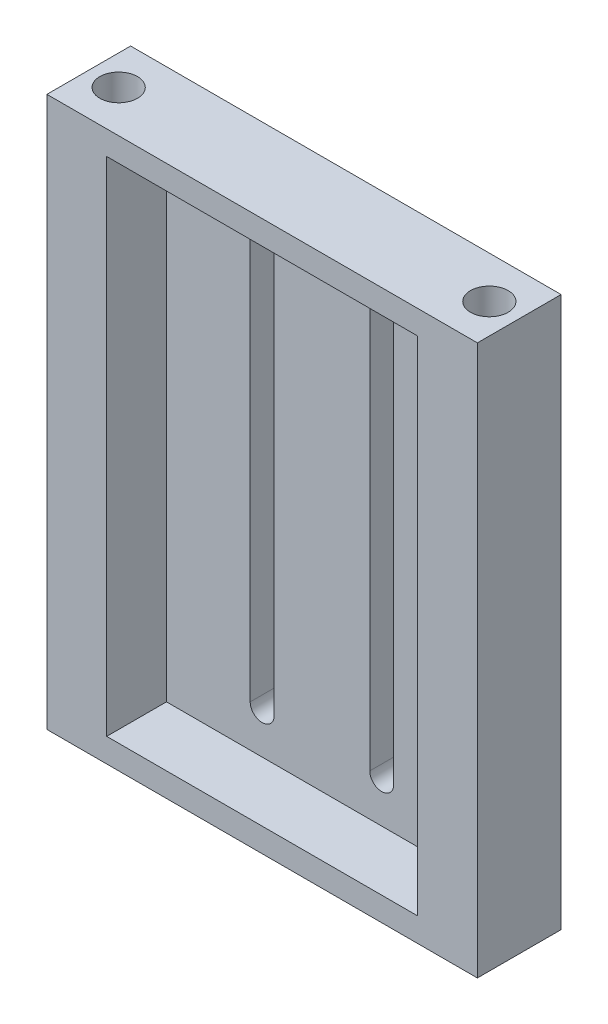
ISO-10303-21;
HEADER;
FILE_DESCRIPTION(('STEP AP214'),'2;1');
FILE_NAME('part.step','',(''),(''),'','','');
FILE_SCHEMA(('AUTOMOTIVE_DESIGN { 1 0 10303 214 1 1 1 1 }'));
ENDSEC;
DATA;
#1=APPLICATION_CONTEXT('core data for automotive mechanical design processes');
#2=APPLICATION_PROTOCOL_DEFINITION('international standard','automotive_design',2000,#1);
#3=PRODUCT_CONTEXT('',#1,'mechanical');
#4=PRODUCT('Part','Part','',(#3));
#5=PRODUCT_RELATED_PRODUCT_CATEGORY('part','',(#4));
#6=PRODUCT_DEFINITION_FORMATION('','',#4);
#7=PRODUCT_DEFINITION_CONTEXT('part definition',#1,'design');
#8=PRODUCT_DEFINITION('design','',#6,#7);
#9=PRODUCT_DEFINITION_SHAPE('','',#8);
#10=(LENGTH_UNIT() NAMED_UNIT(*) SI_UNIT(.MILLI.,.METRE.));
#11=(NAMED_UNIT(*) PLANE_ANGLE_UNIT() SI_UNIT($,.RADIAN.));
#12=(NAMED_UNIT(*) SI_UNIT($,.STERADIAN.) SOLID_ANGLE_UNIT());
#13=UNCERTAINTY_MEASURE_WITH_UNIT(LENGTH_MEASURE(1.E-05),#10,'distance_accuracy_value','');
#14=(GEOMETRIC_REPRESENTATION_CONTEXT(3) GLOBAL_UNCERTAINTY_ASSIGNED_CONTEXT((#13)) GLOBAL_UNIT_ASSIGNED_CONTEXT((#10,
#11,#12)) REPRESENTATION_CONTEXT('',''));
#15=CARTESIAN_POINT('',(0.,0.,0.));
#16=DIRECTION('',(0.,0.,1.));
#17=DIRECTION('',(1.,0.,0.));
#18=AXIS2_PLACEMENT_3D('',#15,#16,#17);
#19=CARTESIAN_POINT('',(18.,23.,2.));
#20=DIRECTION('',(-1.,0.,0.));
#21=DIRECTION('',(0.,-1.,0.));
#22=AXIS2_PLACEMENT_3D('',#19,#20,#21);
#23=PLANE('',#22);
#24=DIRECTION('',(0.,1.,0.));
#25=VECTOR('',#24,1.);
#26=CARTESIAN_POINT('',(18.,23.,0.));
#27=LINE('',#26,#25);
#28=CARTESIAN_POINT('',(18.,-23.,0.));
#29=VERTEX_POINT('',#28);
#30=CARTESIAN_POINT('',(18.,23.,0.));
#31=VERTEX_POINT('',#30);
#32=EDGE_CURVE('E267',#29,#31,#27,.T.);
#33=ORIENTED_EDGE('',*,*,#32,.T.);
#34=DIRECTION('',(0.,0.,-1.));
#35=VECTOR('',#34,1.);
#36=CARTESIAN_POINT('',(18.,23.,2.));
#37=LINE('',#36,#35);
#38=CARTESIAN_POINT('',(18.,23.,7.));
#39=VERTEX_POINT('',#38);
#40=EDGE_CURVE('E11',#39,#31,#37,.T.);
#41=ORIENTED_EDGE('',*,*,#40,.F.);
#42=DIRECTION('',(0.,1.,0.));
#43=VECTOR('',#42,1.);
#44=CARTESIAN_POINT('',(18.,23.,7.));
#45=LINE('',#44,#43);
#46=CARTESIAN_POINT('',(18.,-23.,7.));
#47=VERTEX_POINT('',#46);
#48=EDGE_CURVE('E255',#47,#39,#45,.T.);
#49=ORIENTED_EDGE('',*,*,#48,.F.);
#50=DIRECTION('',(0.,0.,-1.));
#51=VECTOR('',#50,1.);
#52=CARTESIAN_POINT('',(18.,-23.,2.));
#53=LINE('',#52,#51);
#54=EDGE_CURVE('E276',#47,#29,#53,.T.);
#55=ORIENTED_EDGE('',*,*,#54,.T.);
#56=EDGE_LOOP('',(#33,#41,#49,#55));
#57=FACE_BOUND('',#56,.T.);
#58=ADVANCED_FACE('F33',(#57),#23,.F.);
#59=CARTESIAN_POINT('',(-18.,23.,2.));
#60=DIRECTION('',(0.,-1.,0.));
#61=DIRECTION('',(0.,0.,-1.));
#62=AXIS2_PLACEMENT_3D('',#59,#60,#61);
#63=PLANE('',#62);
#64=CARTESIAN_POINT('',(-15.5,23.,3.5));
#65=DIRECTION('',(0.,1.,0.));
#66=DIRECTION('',(0.,0.,1.));
#67=AXIS2_PLACEMENT_3D('',#64,#65,#66);
#68=CIRCLE('',#67,1.575);
#69=CARTESIAN_POINT('',(-15.5,23.,5.075));
#70=VERTEX_POINT('',#69);
#71=EDGE_CURVE('E219',#70,#70,#68,.T.);
#72=ORIENTED_EDGE('',*,*,#71,.F.);
#73=EDGE_LOOP('',(#72));
#74=FACE_BOUND('',#73,.T.);
#75=CARTESIAN_POINT('',(15.5,23.,3.5));
#76=DIRECTION('',(0.,1.,0.));
#77=DIRECTION('',(0.,0.,-1.));
#78=AXIS2_PLACEMENT_3D('',#75,#76,#77);
#79=CIRCLE('',#78,1.575);
#80=CARTESIAN_POINT('',(15.5,23.,1.92499999999999));
#81=VERTEX_POINT('',#80);
#82=EDGE_CURVE('E182',#81,#81,#79,.T.);
#83=ORIENTED_EDGE('',*,*,#82,.F.);
#84=EDGE_LOOP('',(#83));
#85=FACE_BOUND('',#84,.T.);
#86=DIRECTION('',(-1.,0.,0.));
#87=VECTOR('',#86,1.);
#88=CARTESIAN_POINT('',(-18.,23.,0.));
#89=LINE('',#88,#87);
#90=CARTESIAN_POINT('',(-18.,23.,0.));
#91=VERTEX_POINT('',#90);
#92=EDGE_CURVE('E270',#31,#91,#89,.T.);
#93=ORIENTED_EDGE('',*,*,#92,.T.);
#94=DIRECTION('',(0.,0.,-1.));
#95=VECTOR('',#94,1.);
#96=CARTESIAN_POINT('',(-18.,23.,2.));
#97=LINE('',#96,#95);
#98=CARTESIAN_POINT('',(-18.,23.,7.));
#99=VERTEX_POINT('',#98);
#100=EDGE_CURVE('E40',#99,#91,#97,.T.);
#101=ORIENTED_EDGE('',*,*,#100,.F.);
#102=DIRECTION('',(-1.,0.,0.));
#103=VECTOR('',#102,1.);
#104=CARTESIAN_POINT('',(-18.,23.,7.));
#105=LINE('',#104,#103);
#106=EDGE_CURVE('E258',#39,#99,#105,.T.);
#107=ORIENTED_EDGE('',*,*,#106,.F.);
#108=ORIENTED_EDGE('',*,*,#40,.T.);
#109=EDGE_LOOP('',(#93,#101,#107,#108));
#110=FACE_BOUND('',#109,.T.);
#111=ADVANCED_FACE('F300',(#74,#85,#110),#63,.F.);
#112=CARTESIAN_POINT('',(-18.,23.,2.));
#113=DIRECTION('',(1.,0.,0.));
#114=DIRECTION('',(0.,1.,0.));
#115=AXIS2_PLACEMENT_3D('',#112,#113,#114);
#116=PLANE('',#115);
#117=DIRECTION('',(0.,-1.,0.));
#118=VECTOR('',#117,1.);
#119=CARTESIAN_POINT('',(-18.,23.,0.));
#120=LINE('',#119,#118);
#121=CARTESIAN_POINT('',(-18.,-23.,0.));
#122=VERTEX_POINT('',#121);
#123=EDGE_CURVE('E272',#91,#122,#120,.T.);
#124=ORIENTED_EDGE('',*,*,#123,.T.);
#125=DIRECTION('',(0.,0.,-1.));
#126=VECTOR('',#125,1.);
#127=CARTESIAN_POINT('',(-18.,-23.,2.));
#128=LINE('',#127,#126);
#129=CARTESIAN_POINT('',(-18.,-23.,7.));
#130=VERTEX_POINT('',#129);
#131=EDGE_CURVE('E279',#130,#122,#128,.T.);
#132=ORIENTED_EDGE('',*,*,#131,.F.);
#133=DIRECTION('',(0.,-1.,0.));
#134=VECTOR('',#133,1.);
#135=CARTESIAN_POINT('',(-18.,23.,7.));
#136=LINE('',#135,#134);
#137=EDGE_CURVE('E261',#99,#130,#136,.T.);
#138=ORIENTED_EDGE('',*,*,#137,.F.);
#139=ORIENTED_EDGE('',*,*,#100,.T.);
#140=EDGE_LOOP('',(#124,#132,#138,#139));
#141=FACE_BOUND('',#140,.T.);
#142=ADVANCED_FACE('F285',(#141),#116,.F.);
#143=CARTESIAN_POINT('',(-18.,-23.,2.));
#144=DIRECTION('',(0.,1.,0.));
#145=DIRECTION('',(0.,0.,1.));
#146=AXIS2_PLACEMENT_3D('',#143,#144,#145);
#147=PLANE('',#146);
#148=CARTESIAN_POINT('',(-15.5,-23.,3.5));
#149=DIRECTION('',(0.,1.,0.));
#150=DIRECTION('',(0.,0.,1.));
#151=AXIS2_PLACEMENT_3D('',#148,#149,#150);
#152=CIRCLE('',#151,1.575);
#153=CARTESIAN_POINT('',(-15.5,-23.,5.075));
#154=VERTEX_POINT('',#153);
#155=EDGE_CURVE('E215',#154,#154,#152,.T.);
#156=ORIENTED_EDGE('',*,*,#155,.T.);
#157=EDGE_LOOP('',(#156));
#158=FACE_BOUND('',#157,.T.);
#159=CARTESIAN_POINT('',(15.5,-23.,3.5));
#160=DIRECTION('',(0.,1.,0.));
#161=DIRECTION('',(0.,0.,-1.));
#162=AXIS2_PLACEMENT_3D('',#159,#160,#161);
#163=CIRCLE('',#162,1.575);
#164=CARTESIAN_POINT('',(15.5,-23.,1.92499999999999));
#165=VERTEX_POINT('',#164);
#166=EDGE_CURVE('E222',#165,#165,#163,.T.);
#167=ORIENTED_EDGE('',*,*,#166,.T.);
#168=EDGE_LOOP('',(#167));
#169=FACE_BOUND('',#168,.T.);
#170=DIRECTION('',(1.,0.,0.));
#171=VECTOR('',#170,1.);
#172=CARTESIAN_POINT('',(-18.,-23.,0.));
#173=LINE('',#172,#171);
#174=EDGE_CURVE('E274',#122,#29,#173,.T.);
#175=ORIENTED_EDGE('',*,*,#174,.T.);
#176=ORIENTED_EDGE('',*,*,#54,.F.);
#177=DIRECTION('',(1.,0.,0.));
#178=VECTOR('',#177,1.);
#179=CARTESIAN_POINT('',(-18.,-23.,7.));
#180=LINE('',#179,#178);
#181=EDGE_CURVE('E264',#130,#47,#180,.T.);
#182=ORIENTED_EDGE('',*,*,#181,.F.);
#183=ORIENTED_EDGE('',*,*,#131,.T.);
#184=EDGE_LOOP('',(#175,#176,#182,#183));
#185=FACE_BOUND('',#184,.T.);
#186=ADVANCED_FACE('F293',(#158,#169,#185),#147,.F.);
#187=CARTESIAN_POINT('',(0.,0.,0.));
#188=DIRECTION('',(0.,0.,1.));
#189=DIRECTION('',(1.,0.,0.));
#190=AXIS2_PLACEMENT_3D('',#187,#188,#189);
#191=PLANE('',#190);
#192=DIRECTION('',(0.,-1.,0.));
#193=VECTOR('',#192,1.);
#194=CARTESIAN_POINT('',(6.00000000000001,17.5,0.));
#195=LINE('',#194,#193);
#196=CARTESIAN_POINT('',(6.00000000000001,17.5,0.));
#197=VERTEX_POINT('',#196);
#198=CARTESIAN_POINT('',(6.,-17.5,0.));
#199=VERTEX_POINT('',#198);
#200=EDGE_CURVE('E175',#197,#199,#195,.T.);
#201=ORIENTED_EDGE('',*,*,#200,.F.);
#202=CARTESIAN_POINT('',(5.,17.5,0.));
#203=DIRECTION('',(0.,0.,-1.));
#204=DIRECTION('',(-1.,0.,0.));
#205=AXIS2_PLACEMENT_3D('',#202,#203,#204);
#206=CIRCLE('',#205,1.);
#207=CARTESIAN_POINT('',(4.,17.5,0.));
#208=VERTEX_POINT('',#207);
#209=EDGE_CURVE('E47',#208,#197,#206,.T.);
#210=ORIENTED_EDGE('',*,*,#209,.F.);
#211=DIRECTION('',(0.,1.,0.));
#212=VECTOR('',#211,1.);
#213=CARTESIAN_POINT('',(4.,17.5,0.));
#214=LINE('',#213,#212);
#215=CARTESIAN_POINT('',(4.,-17.5,0.));
#216=VERTEX_POINT('',#215);
#217=EDGE_CURVE('E166',#216,#208,#214,.T.);
#218=ORIENTED_EDGE('',*,*,#217,.F.);
#219=CARTESIAN_POINT('',(5.,-17.5,0.));
#220=DIRECTION('',(0.,0.,-1.));
#221=DIRECTION('',(-1.,0.,0.));
#222=AXIS2_PLACEMENT_3D('',#219,#220,#221);
#223=CIRCLE('',#222,1.);
#224=EDGE_CURVE('E169',#199,#216,#223,.T.);
#225=ORIENTED_EDGE('',*,*,#224,.F.);
#226=EDGE_LOOP('',(#201,#210,#218,#225));
#227=FACE_BOUND('',#226,.T.);
#228=DIRECTION('',(0.,-1.,0.));
#229=VECTOR('',#228,1.);
#230=CARTESIAN_POINT('',(-4.,17.5,0.));
#231=LINE('',#230,#229);
#232=CARTESIAN_POINT('',(-4.,17.5,0.));
#233=VERTEX_POINT('',#232);
#234=CARTESIAN_POINT('',(-4.,-17.5,0.));
#235=VERTEX_POINT('',#234);
#236=EDGE_CURVE('E201',#233,#235,#231,.T.);
#237=ORIENTED_EDGE('',*,*,#236,.F.);
#238=CARTESIAN_POINT('',(-5.,17.5,0.));
#239=DIRECTION('',(0.,0.,-1.));
#240=DIRECTION('',(1.,0.,0.));
#241=AXIS2_PLACEMENT_3D('',#238,#239,#240);
#242=CIRCLE('',#241,1.00000000000001);
#243=CARTESIAN_POINT('',(-6.00000000000001,17.5,0.));
#244=VERTEX_POINT('',#243);
#245=EDGE_CURVE('E55',#244,#233,#242,.T.);
#246=ORIENTED_EDGE('',*,*,#245,.F.);
#247=DIRECTION('',(0.,1.,0.));
#248=VECTOR('',#247,1.);
#249=CARTESIAN_POINT('',(-6.00000000000001,17.5,0.));
#250=LINE('',#249,#248);
#251=CARTESIAN_POINT('',(-6.,-17.5,0.));
#252=VERTEX_POINT('',#251);
#253=EDGE_CURVE('E190',#252,#244,#250,.T.);
#254=ORIENTED_EDGE('',*,*,#253,.F.);
#255=CARTESIAN_POINT('',(-5.,-17.5,0.));
#256=DIRECTION('',(0.,0.,-1.));
#257=DIRECTION('',(1.,0.,0.));
#258=AXIS2_PLACEMENT_3D('',#255,#256,#257);
#259=CIRCLE('',#258,1.00000000000001);
#260=EDGE_CURVE('E204',#235,#252,#259,.T.);
#261=ORIENTED_EDGE('',*,*,#260,.F.);
#262=EDGE_LOOP('',(#237,#246,#254,#261));
#263=FACE_BOUND('',#262,.T.);
#264=ORIENTED_EDGE('',*,*,#32,.F.);
#265=ORIENTED_EDGE('',*,*,#174,.F.);
#266=ORIENTED_EDGE('',*,*,#123,.F.);
#267=ORIENTED_EDGE('',*,*,#92,.F.);
#268=EDGE_LOOP('',(#264,#265,#266,#267));
#269=FACE_BOUND('',#268,.T.);
#270=ADVANCED_FACE('F291',(#227,#263,#269),#191,.F.);
#271=CARTESIAN_POINT('',(0.,0.,7.));
#272=DIRECTION('',(0.,0.,1.));
#273=DIRECTION('',(1.,0.,0.));
#274=AXIS2_PLACEMENT_3D('',#271,#272,#273);
#275=PLANE('',#274);
#276=ORIENTED_EDGE('',*,*,#48,.T.);
#277=ORIENTED_EDGE('',*,*,#106,.T.);
#278=ORIENTED_EDGE('',*,*,#137,.T.);
#279=ORIENTED_EDGE('',*,*,#181,.T.);
#280=EDGE_LOOP('',(#276,#277,#278,#279));
#281=FACE_BOUND('',#280,.T.);
#282=DIRECTION('',(-1.,0.,0.));
#283=VECTOR('',#282,1.);
#284=CARTESIAN_POINT('',(-13.,21.,7.));
#285=LINE('',#284,#283);
#286=CARTESIAN_POINT('',(13.,21.,7.));
#287=VERTEX_POINT('',#286);
#288=CARTESIAN_POINT('',(-13.,21.,7.));
#289=VERTEX_POINT('',#288);
#290=EDGE_CURVE('E229',#287,#289,#285,.T.);
#291=ORIENTED_EDGE('',*,*,#290,.F.);
#292=DIRECTION('',(0.,1.,0.));
#293=VECTOR('',#292,1.);
#294=CARTESIAN_POINT('',(13.,21.,7.));
#295=LINE('',#294,#293);
#296=CARTESIAN_POINT('',(13.,-21.,7.));
#297=VERTEX_POINT('',#296);
#298=EDGE_CURVE('E227',#297,#287,#295,.T.);
#299=ORIENTED_EDGE('',*,*,#298,.F.);
#300=DIRECTION('',(1.,0.,0.));
#301=VECTOR('',#300,1.);
#302=CARTESIAN_POINT('',(-13.,-21.,7.));
#303=LINE('',#302,#301);
#304=CARTESIAN_POINT('',(-13.,-21.,7.));
#305=VERTEX_POINT('',#304);
#306=EDGE_CURVE('E235',#305,#297,#303,.T.);
#307=ORIENTED_EDGE('',*,*,#306,.F.);
#308=DIRECTION('',(0.,-1.,0.));
#309=VECTOR('',#308,1.);
#310=CARTESIAN_POINT('',(-13.,21.,7.));
#311=LINE('',#310,#309);
#312=EDGE_CURVE('E232',#289,#305,#311,.T.);
#313=ORIENTED_EDGE('',*,*,#312,.F.);
#314=EDGE_LOOP('',(#291,#299,#307,#313));
#315=FACE_BOUND('',#314,.T.);
#316=ADVANCED_FACE('F298',(#281,#315),#275,.T.);
#317=CARTESIAN_POINT('',(13.,21.,7.));
#318=DIRECTION('',(-1.,0.,0.));
#319=DIRECTION('',(0.,-1.,0.));
#320=AXIS2_PLACEMENT_3D('',#317,#318,#319);
#321=PLANE('',#320);
#322=DIRECTION('',(0.,1.,0.));
#323=VECTOR('',#322,1.);
#324=CARTESIAN_POINT('',(13.,21.,2.));
#325=LINE('',#324,#323);
#326=CARTESIAN_POINT('',(13.,-21.,2.));
#327=VERTEX_POINT('',#326);
#328=CARTESIAN_POINT('',(13.,21.,2.));
#329=VERTEX_POINT('',#328);
#330=EDGE_CURVE('E218',#327,#329,#325,.T.);
#331=ORIENTED_EDGE('',*,*,#330,.F.);
#332=DIRECTION('',(0.,0.,-1.));
#333=VECTOR('',#332,1.);
#334=CARTESIAN_POINT('',(13.,-21.,7.));
#335=LINE('',#334,#333);
#336=EDGE_CURVE('E237',#297,#327,#335,.T.);
#337=ORIENTED_EDGE('',*,*,#336,.F.);
#338=ORIENTED_EDGE('',*,*,#298,.T.);
#339=DIRECTION('',(0.,0.,-1.));
#340=VECTOR('',#339,1.);
#341=CARTESIAN_POINT('',(13.,21.,7.));
#342=LINE('',#341,#340);
#343=EDGE_CURVE('E252',#287,#329,#342,.T.);
#344=ORIENTED_EDGE('',*,*,#343,.T.);
#345=EDGE_LOOP('',(#331,#337,#338,#344));
#346=FACE_BOUND('',#345,.T.);
#347=ADVANCED_FACE('F323',(#346),#321,.T.);
#348=CARTESIAN_POINT('',(-13.,21.,7.));
#349=DIRECTION('',(0.,-1.,0.));
#350=DIRECTION('',(0.,0.,-1.));
#351=AXIS2_PLACEMENT_3D('',#348,#349,#350);
#352=PLANE('',#351);
#353=DIRECTION('',(-1.,0.,0.));
#354=VECTOR('',#353,1.);
#355=CARTESIAN_POINT('',(-13.,21.,2.));
#356=LINE('',#355,#354);
#357=CARTESIAN_POINT('',(-13.,21.,2.));
#358=VERTEX_POINT('',#357);
#359=EDGE_CURVE('E239',#329,#358,#356,.T.);
#360=ORIENTED_EDGE('',*,*,#359,.F.);
#361=ORIENTED_EDGE('',*,*,#343,.F.);
#362=ORIENTED_EDGE('',*,*,#290,.T.);
#363=DIRECTION('',(0.,0.,-1.));
#364=VECTOR('',#363,1.);
#365=CARTESIAN_POINT('',(-13.,21.,7.));
#366=LINE('',#365,#364);
#367=EDGE_CURVE('E249',#289,#358,#366,.T.);
#368=ORIENTED_EDGE('',*,*,#367,.T.);
#369=EDGE_LOOP('',(#360,#361,#362,#368));
#370=FACE_BOUND('',#369,.T.);
#371=ADVANCED_FACE('F326',(#370),#352,.T.);
#372=CARTESIAN_POINT('',(-13.,21.,7.));
#373=DIRECTION('',(1.,0.,0.));
#374=DIRECTION('',(0.,1.,0.));
#375=AXIS2_PLACEMENT_3D('',#372,#373,#374);
#376=PLANE('',#375);
#377=DIRECTION('',(0.,-1.,0.));
#378=VECTOR('',#377,1.);
#379=CARTESIAN_POINT('',(-13.,21.,2.));
#380=LINE('',#379,#378);
#381=CARTESIAN_POINT('',(-13.,-21.,2.));
#382=VERTEX_POINT('',#381);
#383=EDGE_CURVE('E241',#358,#382,#380,.T.);
#384=ORIENTED_EDGE('',*,*,#383,.F.);
#385=ORIENTED_EDGE('',*,*,#367,.F.);
#386=ORIENTED_EDGE('',*,*,#312,.T.);
#387=DIRECTION('',(0.,0.,-1.));
#388=VECTOR('',#387,1.);
#389=CARTESIAN_POINT('',(-13.,-21.,7.));
#390=LINE('',#389,#388);
#391=EDGE_CURVE('E246',#305,#382,#390,.T.);
#392=ORIENTED_EDGE('',*,*,#391,.T.);
#393=EDGE_LOOP('',(#384,#385,#386,#392));
#394=FACE_BOUND('',#393,.T.);
#395=ADVANCED_FACE('F330',(#394),#376,.T.);
#396=CARTESIAN_POINT('',(-13.,-21.,7.));
#397=DIRECTION('',(0.,1.,0.));
#398=DIRECTION('',(0.,0.,1.));
#399=AXIS2_PLACEMENT_3D('',#396,#397,#398);
#400=PLANE('',#399);
#401=DIRECTION('',(1.,0.,0.));
#402=VECTOR('',#401,1.);
#403=CARTESIAN_POINT('',(-13.,-21.,2.));
#404=LINE('',#403,#402);
#405=EDGE_CURVE('E230',#382,#327,#404,.T.);
#406=ORIENTED_EDGE('',*,*,#405,.F.);
#407=ORIENTED_EDGE('',*,*,#391,.F.);
#408=ORIENTED_EDGE('',*,*,#306,.T.);
#409=ORIENTED_EDGE('',*,*,#336,.T.);
#410=EDGE_LOOP('',(#406,#407,#408,#409));
#411=FACE_BOUND('',#410,.T.);
#412=ADVANCED_FACE('F320',(#411),#400,.T.);
#413=CARTESIAN_POINT('',(0.,0.,2.));
#414=DIRECTION('',(0.,0.,1.));
#415=DIRECTION('',(1.,0.,0.));
#416=AXIS2_PLACEMENT_3D('',#413,#414,#415);
#417=PLANE('',#416);
#418=CARTESIAN_POINT('',(5.,17.5,2.));
#419=DIRECTION('',(0.,0.,-1.));
#420=DIRECTION('',(-1.,0.,0.));
#421=AXIS2_PLACEMENT_3D('',#418,#419,#420);
#422=CIRCLE('',#421,1.);
#423=CARTESIAN_POINT('',(4.,17.5,2.));
#424=VERTEX_POINT('',#423);
#425=CARTESIAN_POINT('',(6.00000000000001,17.5,2.));
#426=VERTEX_POINT('',#425);
#427=EDGE_CURVE('E147',#424,#426,#422,.T.);
#428=ORIENTED_EDGE('',*,*,#427,.T.);
#429=DIRECTION('',(0.,-1.,0.));
#430=VECTOR('',#429,1.);
#431=CARTESIAN_POINT('',(6.00000000000001,17.5,2.));
#432=LINE('',#431,#430);
#433=CARTESIAN_POINT('',(6.00000000000001,-17.5,2.));
#434=VERTEX_POINT('',#433);
#435=EDGE_CURVE('E157',#426,#434,#432,.T.);
#436=ORIENTED_EDGE('',*,*,#435,.T.);
#437=CARTESIAN_POINT('',(5.,-17.5,2.));
#438=DIRECTION('',(0.,0.,-1.));
#439=DIRECTION('',(-1.,0.,0.));
#440=AXIS2_PLACEMENT_3D('',#437,#438,#439);
#441=CIRCLE('',#440,1.);
#442=CARTESIAN_POINT('',(4.,-17.5,2.));
#443=VERTEX_POINT('',#442);
#444=EDGE_CURVE('E161',#434,#443,#441,.T.);
#445=ORIENTED_EDGE('',*,*,#444,.T.);
#446=DIRECTION('',(0.,1.,0.));
#447=VECTOR('',#446,1.);
#448=CARTESIAN_POINT('',(4.,17.5,2.));
#449=LINE('',#448,#447);
#450=EDGE_CURVE('E153',#443,#424,#449,.T.);
#451=ORIENTED_EDGE('',*,*,#450,.T.);
#452=EDGE_LOOP('',(#428,#436,#445,#451));
#453=FACE_BOUND('',#452,.T.);
#454=CARTESIAN_POINT('',(-5.,17.5,2.));
#455=DIRECTION('',(0.,0.,-1.));
#456=DIRECTION('',(1.,0.,0.));
#457=AXIS2_PLACEMENT_3D('',#454,#455,#456);
#458=CIRCLE('',#457,1.00000000000001);
#459=CARTESIAN_POINT('',(-6.00000000000001,17.5,2.));
#460=VERTEX_POINT('',#459);
#461=CARTESIAN_POINT('',(-4.,17.5,2.));
#462=VERTEX_POINT('',#461);
#463=EDGE_CURVE('E186',#460,#462,#458,.T.);
#464=ORIENTED_EDGE('',*,*,#463,.T.);
#465=DIRECTION('',(0.,-1.,0.));
#466=VECTOR('',#465,1.);
#467=CARTESIAN_POINT('',(-4.,17.5,2.));
#468=LINE('',#467,#466);
#469=CARTESIAN_POINT('',(-4.,-17.5,2.));
#470=VERTEX_POINT('',#469);
#471=EDGE_CURVE('E189',#462,#470,#468,.T.);
#472=ORIENTED_EDGE('',*,*,#471,.T.);
#473=CARTESIAN_POINT('',(-5.,-17.5,2.));
#474=DIRECTION('',(0.,0.,-1.));
#475=DIRECTION('',(1.,0.,0.));
#476=AXIS2_PLACEMENT_3D('',#473,#474,#475);
#477=CIRCLE('',#476,1.00000000000001);
#478=CARTESIAN_POINT('',(-6.,-17.5,2.));
#479=VERTEX_POINT('',#478);
#480=EDGE_CURVE('E193',#470,#479,#477,.T.);
#481=ORIENTED_EDGE('',*,*,#480,.T.);
#482=DIRECTION('',(0.,1.,0.));
#483=VECTOR('',#482,1.);
#484=CARTESIAN_POINT('',(-6.00000000000001,17.5,2.));
#485=LINE('',#484,#483);
#486=EDGE_CURVE('E196',#479,#460,#485,.T.);
#487=ORIENTED_EDGE('',*,*,#486,.T.);
#488=EDGE_LOOP('',(#464,#472,#481,#487));
#489=FACE_BOUND('',#488,.T.);
#490=ORIENTED_EDGE('',*,*,#330,.T.);
#491=ORIENTED_EDGE('',*,*,#359,.T.);
#492=ORIENTED_EDGE('',*,*,#383,.T.);
#493=ORIENTED_EDGE('',*,*,#405,.T.);
#494=EDGE_LOOP('',(#490,#491,#492,#493));
#495=FACE_BOUND('',#494,.T.);
#496=ADVANCED_FACE('F163',(#453,#489,#495),#417,.T.);
#497=CARTESIAN_POINT('',(15.5,-23.,3.5));
#498=DIRECTION('',(0.,1.,0.));
#499=DIRECTION('',(0.,0.,1.));
#500=AXIS2_PLACEMENT_3D('',#497,#498,#499);
#501=CYLINDRICAL_SURFACE('',#500,1.575);
#502=ORIENTED_EDGE('',*,*,#166,.F.);
#503=EDGE_LOOP('',(#502));
#504=FACE_BOUND('',#503,.T.);
#505=ORIENTED_EDGE('',*,*,#82,.T.);
#506=EDGE_LOOP('',(#505));
#507=FACE_BOUND('',#506,.T.);
#508=ADVANCED_FACE('F319',(#504,#507),#501,.F.);
#509=CARTESIAN_POINT('',(-15.5,-23.,3.5));
#510=DIRECTION('',(0.,1.,0.));
#511=DIRECTION('',(0.,0.,1.));
#512=AXIS2_PLACEMENT_3D('',#509,#510,#511);
#513=CYLINDRICAL_SURFACE('',#512,1.575);
#514=ORIENTED_EDGE('',*,*,#155,.F.);
#515=EDGE_LOOP('',(#514));
#516=FACE_BOUND('',#515,.T.);
#517=ORIENTED_EDGE('',*,*,#71,.T.);
#518=EDGE_LOOP('',(#517));
#519=FACE_BOUND('',#518,.T.);
#520=ADVANCED_FACE('F340',(#516,#519),#513,.F.);
#521=CARTESIAN_POINT('',(-5.,17.5,2.));
#522=DIRECTION('',(0.,0.,-1.));
#523=DIRECTION('',(-1.,0.,0.));
#524=AXIS2_PLACEMENT_3D('',#521,#522,#523);
#525=CYLINDRICAL_SURFACE('',#524,1.00000000000001);
#526=ORIENTED_EDGE('',*,*,#245,.T.);
#527=DIRECTION('',(0.,0.,-1.));
#528=VECTOR('',#527,1.);
#529=CARTESIAN_POINT('',(-4.,17.5,2.));
#530=LINE('',#529,#528);
#531=EDGE_CURVE('E199',#462,#233,#530,.T.);
#532=ORIENTED_EDGE('',*,*,#531,.F.);
#533=ORIENTED_EDGE('',*,*,#463,.F.);
#534=DIRECTION('',(0.,0.,-1.));
#535=VECTOR('',#534,1.);
#536=CARTESIAN_POINT('',(-6.00000000000001,17.5,2.));
#537=LINE('',#536,#535);
#538=EDGE_CURVE('E176',#460,#244,#537,.T.);
#539=ORIENTED_EDGE('',*,*,#538,.T.);
#540=EDGE_LOOP('',(#526,#532,#533,#539));
#541=FACE_BOUND('',#540,.T.);
#542=ADVANCED_FACE('F344',(#541),#525,.F.);
#543=CARTESIAN_POINT('',(-6.00000000000001,17.5,2.));
#544=DIRECTION('',(-1.,0.,0.));
#545=DIRECTION('',(0.,0.,1.));
#546=AXIS2_PLACEMENT_3D('',#543,#544,#545);
#547=PLANE('',#546);
#548=ORIENTED_EDGE('',*,*,#253,.T.);
#549=ORIENTED_EDGE('',*,*,#538,.F.);
#550=ORIENTED_EDGE('',*,*,#486,.F.);
#551=DIRECTION('',(0.,0.,-1.));
#552=VECTOR('',#551,1.);
#553=CARTESIAN_POINT('',(-6.,-17.5,2.));
#554=LINE('',#553,#552);
#555=EDGE_CURVE('E210',#479,#252,#554,.T.);
#556=ORIENTED_EDGE('',*,*,#555,.T.);
#557=EDGE_LOOP('',(#548,#549,#550,#556));
#558=FACE_BOUND('',#557,.T.);
#559=ADVANCED_FACE('F348',(#558),#547,.F.);
#560=CARTESIAN_POINT('',(-5.,-17.5,2.));
#561=DIRECTION('',(0.,0.,-1.));
#562=DIRECTION('',(-1.,0.,0.));
#563=AXIS2_PLACEMENT_3D('',#560,#561,#562);
#564=CYLINDRICAL_SURFACE('',#563,1.00000000000001);
#565=ORIENTED_EDGE('',*,*,#260,.T.);
#566=ORIENTED_EDGE('',*,*,#555,.F.);
#567=ORIENTED_EDGE('',*,*,#480,.F.);
#568=DIRECTION('',(0.,0.,-1.));
#569=VECTOR('',#568,1.);
#570=CARTESIAN_POINT('',(-4.,-17.5,2.));
#571=LINE('',#570,#569);
#572=EDGE_CURVE('E212',#470,#235,#571,.T.);
#573=ORIENTED_EDGE('',*,*,#572,.T.);
#574=EDGE_LOOP('',(#565,#566,#567,#573));
#575=FACE_BOUND('',#574,.T.);
#576=ADVANCED_FACE('F352',(#575),#564,.F.);
#577=CARTESIAN_POINT('',(-4.,17.5,2.));
#578=DIRECTION('',(1.,0.,0.));
#579=DIRECTION('',(0.,0.,-1.));
#580=AXIS2_PLACEMENT_3D('',#577,#578,#579);
#581=PLANE('',#580);
#582=ORIENTED_EDGE('',*,*,#236,.T.);
#583=ORIENTED_EDGE('',*,*,#572,.F.);
#584=ORIENTED_EDGE('',*,*,#471,.F.);
#585=ORIENTED_EDGE('',*,*,#531,.T.);
#586=EDGE_LOOP('',(#582,#583,#584,#585));
#587=FACE_BOUND('',#586,.T.);
#588=ADVANCED_FACE('F349',(#587),#581,.F.);
#589=CARTESIAN_POINT('',(5.,17.5,2.));
#590=DIRECTION('',(0.,0.,-1.));
#591=DIRECTION('',(-1.,0.,0.));
#592=AXIS2_PLACEMENT_3D('',#589,#590,#591);
#593=CYLINDRICAL_SURFACE('',#592,1.);
#594=ORIENTED_EDGE('',*,*,#209,.T.);
#595=DIRECTION('',(0.,0.,-1.));
#596=VECTOR('',#595,1.);
#597=CARTESIAN_POINT('',(6.00000000000001,17.5,2.));
#598=LINE('',#597,#596);
#599=EDGE_CURVE('E143',#426,#197,#598,.T.);
#600=ORIENTED_EDGE('',*,*,#599,.F.);
#601=ORIENTED_EDGE('',*,*,#427,.F.);
#602=DIRECTION('',(0.,0.,-1.));
#603=VECTOR('',#602,1.);
#604=CARTESIAN_POINT('',(4.,17.5,2.));
#605=LINE('',#604,#603);
#606=EDGE_CURVE('E180',#424,#208,#605,.T.);
#607=ORIENTED_EDGE('',*,*,#606,.T.);
#608=EDGE_LOOP('',(#594,#600,#601,#607));
#609=FACE_BOUND('',#608,.T.);
#610=ADVANCED_FACE('F145',(#609),#593,.F.);
#611=CARTESIAN_POINT('',(4.,17.5,2.));
#612=DIRECTION('',(-1.,0.,0.));
#613=DIRECTION('',(0.,0.,1.));
#614=AXIS2_PLACEMENT_3D('',#611,#612,#613);
#615=PLANE('',#614);
#616=ORIENTED_EDGE('',*,*,#217,.T.);
#617=ORIENTED_EDGE('',*,*,#606,.F.);
#618=ORIENTED_EDGE('',*,*,#450,.F.);
#619=DIRECTION('',(0.,0.,-1.));
#620=VECTOR('',#619,1.);
#621=CARTESIAN_POINT('',(4.,-17.5,2.));
#622=LINE('',#621,#620);
#623=EDGE_CURVE('E183',#443,#216,#622,.T.);
#624=ORIENTED_EDGE('',*,*,#623,.T.);
#625=EDGE_LOOP('',(#616,#617,#618,#624));
#626=FACE_BOUND('',#625,.T.);
#627=ADVANCED_FACE('F362',(#626),#615,.F.);
#628=CARTESIAN_POINT('',(5.,-17.5,2.));
#629=DIRECTION('',(0.,0.,-1.));
#630=DIRECTION('',(-1.,0.,0.));
#631=AXIS2_PLACEMENT_3D('',#628,#629,#630);
#632=CYLINDRICAL_SURFACE('',#631,1.);
#633=ORIENTED_EDGE('',*,*,#224,.T.);
#634=ORIENTED_EDGE('',*,*,#623,.F.);
#635=ORIENTED_EDGE('',*,*,#444,.F.);
#636=DIRECTION('',(0.,0.,-1.));
#637=VECTOR('',#636,1.);
#638=CARTESIAN_POINT('',(6.,-17.5,2.));
#639=LINE('',#638,#637);
#640=EDGE_CURVE('E152',#434,#199,#639,.T.);
#641=ORIENTED_EDGE('',*,*,#640,.T.);
#642=EDGE_LOOP('',(#633,#634,#635,#641));
#643=FACE_BOUND('',#642,.T.);
#644=ADVANCED_FACE('F365',(#643),#632,.F.);
#645=CARTESIAN_POINT('',(6.00000000000001,17.5,2.));
#646=DIRECTION('',(1.,0.,0.));
#647=DIRECTION('',(0.,0.,-1.));
#648=AXIS2_PLACEMENT_3D('',#645,#646,#647);
#649=PLANE('',#648);
#650=ORIENTED_EDGE('',*,*,#200,.T.);
#651=ORIENTED_EDGE('',*,*,#640,.F.);
#652=ORIENTED_EDGE('',*,*,#435,.F.);
#653=ORIENTED_EDGE('',*,*,#599,.T.);
#654=EDGE_LOOP('',(#650,#651,#652,#653));
#655=FACE_BOUND('',#654,.T.);
#656=ADVANCED_FACE('F158',(#655),#649,.F.);
#657=CLOSED_SHELL('',(#58,#111,#142,#186,#270,#316,#347,#371,#395,#412,#496,#508,#520,#542,#559,
#576,#588,#610,#627,#644,#656));
#658=MANIFOLD_SOLID_BREP('B2',#657);
#659=ADVANCED_BREP_SHAPE_REPRESENTATION('',(#18,#658),#14);
#660=SHAPE_DEFINITION_REPRESENTATION(#9,#659);
ENDSEC;
END-ISO-10303-21;
